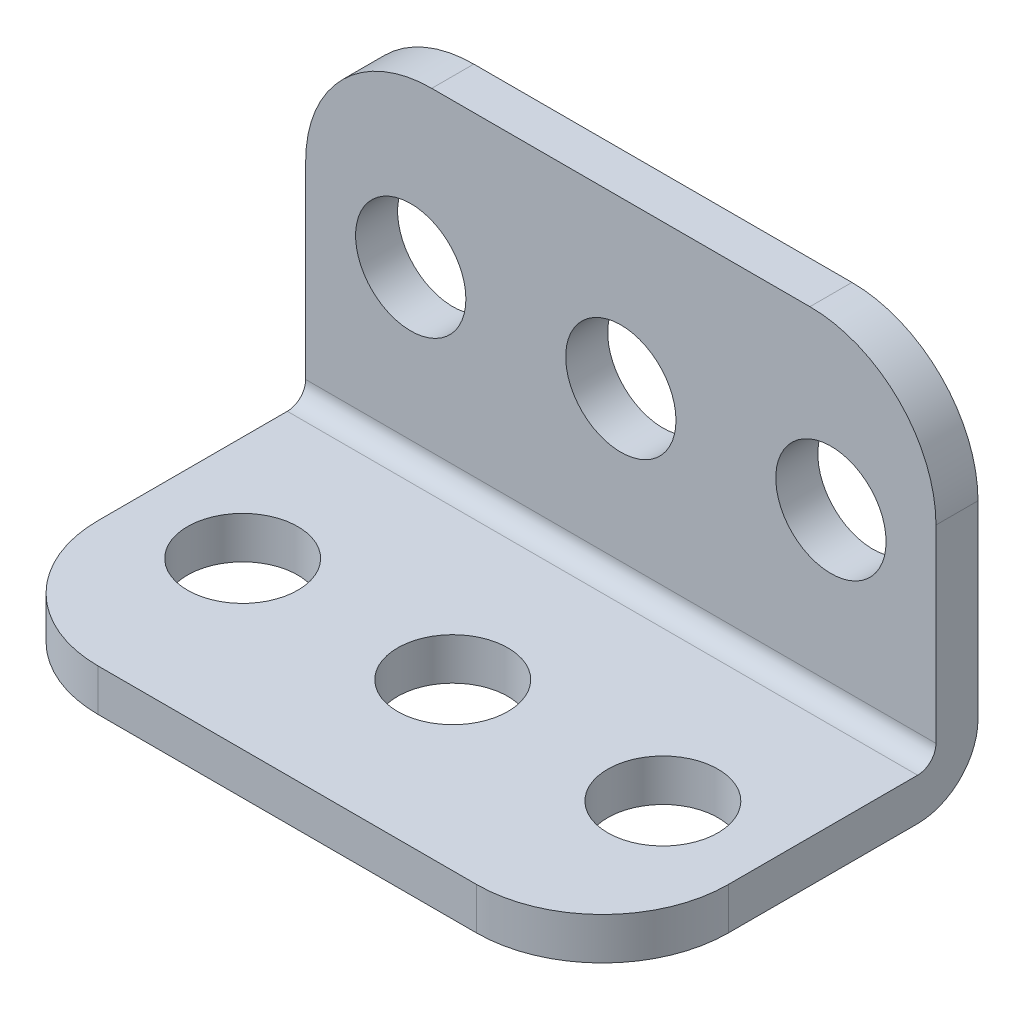
ISO-10303-21;
HEADER;
FILE_DESCRIPTION(('STEP AP214'),'2;1');
FILE_NAME('part.step','',(''),(''),'','','');
FILE_SCHEMA(('AUTOMOTIVE_DESIGN { 1 0 10303 214 1 1 1 1 }'));
ENDSEC;
DATA;
#1=APPLICATION_CONTEXT('core data for automotive mechanical design processes');
#2=APPLICATION_PROTOCOL_DEFINITION('international standard','automotive_design',2000,#1);
#3=PRODUCT_CONTEXT('',#1,'mechanical');
#4=PRODUCT('Part','Part','',(#3));
#5=PRODUCT_RELATED_PRODUCT_CATEGORY('part','',(#4));
#6=PRODUCT_DEFINITION_FORMATION('','',#4);
#7=PRODUCT_DEFINITION_CONTEXT('part definition',#1,'design');
#8=PRODUCT_DEFINITION('design','',#6,#7);
#9=PRODUCT_DEFINITION_SHAPE('','',#8);
#10=(LENGTH_UNIT() NAMED_UNIT(*) SI_UNIT(.MILLI.,.METRE.));
#11=(NAMED_UNIT(*) PLANE_ANGLE_UNIT() SI_UNIT($,.RADIAN.));
#12=(NAMED_UNIT(*) SI_UNIT($,.STERADIAN.) SOLID_ANGLE_UNIT());
#13=UNCERTAINTY_MEASURE_WITH_UNIT(LENGTH_MEASURE(1.E-05),#10,'distance_accuracy_value','');
#14=(GEOMETRIC_REPRESENTATION_CONTEXT(3) GLOBAL_UNCERTAINTY_ASSIGNED_CONTEXT((#13)) GLOBAL_UNIT_ASSIGNED_CONTEXT((#10,
#11,#12)) REPRESENTATION_CONTEXT('',''));
#15=CARTESIAN_POINT('',(0.,0.,0.));
#16=DIRECTION('',(0.,0.,1.));
#17=DIRECTION('',(1.,0.,0.));
#18=AXIS2_PLACEMENT_3D('',#15,#16,#17);
#19=CARTESIAN_POINT('',(19.2,7.9,-14.3));
#20=DIRECTION('',(0.,0.,1.));
#21=DIRECTION('',(0.,-1.,0.));
#22=AXIS2_PLACEMENT_3D('',#19,#20,#21);
#23=CYLINDRICAL_SURFACE('',#22,4.8);
#24=CARTESIAN_POINT('',(19.2,7.9,-14.3));
#25=DIRECTION('',(0.,0.,1.));
#26=DIRECTION('',(0.,-1.,0.));
#27=AXIS2_PLACEMENT_3D('',#24,#25,#26);
#28=CIRCLE('',#27,4.8);
#29=CARTESIAN_POINT('',(24.,7.9,-14.3));
#30=VERTEX_POINT('',#29);
#31=CARTESIAN_POINT('',(19.2,12.7,-14.3));
#32=VERTEX_POINT('',#31);
#33=EDGE_CURVE('E19',#30,#32,#28,.T.);
#34=ORIENTED_EDGE('',*,*,#33,.T.);
#35=DIRECTION('',(0.,0.,-1.));
#36=VECTOR('',#35,1.);
#37=CARTESIAN_POINT('',(19.2,12.7,-14.3));
#38=LINE('',#37,#36);
#39=CARTESIAN_POINT('',(19.2,12.7,-12.7));
#40=VERTEX_POINT('',#39);
#41=EDGE_CURVE('E109',#32,#40,#38,.F.);
#42=ORIENTED_EDGE('',*,*,#41,.T.);
#43=CARTESIAN_POINT('',(19.2,7.90000000000001,-12.7));
#44=DIRECTION('',(0.,0.,1.));
#45=DIRECTION('',(0.,-1.,0.));
#46=AXIS2_PLACEMENT_3D('',#43,#44,#45);
#47=CIRCLE('',#46,4.8);
#48=CARTESIAN_POINT('',(24.,7.90000000000001,-12.7));
#49=VERTEX_POINT('',#48);
#50=EDGE_CURVE('E105',#49,#40,#47,.T.);
#51=ORIENTED_EDGE('',*,*,#50,.F.);
#52=DIRECTION('',(0.,0.,1.));
#53=VECTOR('',#52,1.);
#54=CARTESIAN_POINT('',(24.,7.9,-14.3));
#55=LINE('',#54,#53);
#56=EDGE_CURVE('E102',#49,#30,#55,.F.);
#57=ORIENTED_EDGE('',*,*,#56,.T.);
#58=EDGE_LOOP('',(#34,#42,#51,#57));
#59=FACE_BOUND('',#58,.T.);
#60=ADVANCED_FACE('F16',(#59),#23,.T.);
#61=CARTESIAN_POINT('',(24.,12.7,-14.3));
#62=DIRECTION('',(0.,-1.,0.));
#63=DIRECTION('',(0.,0.,-1.));
#64=AXIS2_PLACEMENT_3D('',#61,#62,#63);
#65=PLANE('',#64);
#66=DIRECTION('',(1.,0.,0.));
#67=VECTOR('',#66,1.);
#68=CARTESIAN_POINT('',(0.,12.7,-12.7));
#69=LINE('',#68,#67);
#70=CARTESIAN_POINT('',(4.8,12.7,-12.7));
#71=VERTEX_POINT('',#70);
#72=EDGE_CURVE('E158',#40,#71,#69,.F.);
#73=ORIENTED_EDGE('',*,*,#72,.F.);
#74=ORIENTED_EDGE('',*,*,#41,.F.);
#75=DIRECTION('',(1.,0.,0.));
#76=VECTOR('',#75,1.);
#77=CARTESIAN_POINT('',(0.,12.7,-14.3));
#78=LINE('',#77,#76);
#79=CARTESIAN_POINT('',(4.8,12.7,-14.3));
#80=VERTEX_POINT('',#79);
#81=EDGE_CURVE('E118',#32,#80,#78,.F.);
#82=ORIENTED_EDGE('',*,*,#81,.T.);
#83=DIRECTION('',(0.,0.,1.));
#84=VECTOR('',#83,1.);
#85=CARTESIAN_POINT('',(4.8,12.7,-14.3));
#86=LINE('',#85,#84);
#87=EDGE_CURVE('E168',#71,#80,#86,.F.);
#88=ORIENTED_EDGE('',*,*,#87,.F.);
#89=EDGE_LOOP('',(#73,#74,#82,#88));
#90=FACE_BOUND('',#89,.T.);
#91=ADVANCED_FACE('F268',(#90),#65,.F.);
#92=CARTESIAN_POINT('',(4.8,7.9,-14.3));
#93=DIRECTION('',(0.,0.,1.));
#94=DIRECTION('',(0.,-1.,0.));
#95=AXIS2_PLACEMENT_3D('',#92,#93,#94);
#96=CYLINDRICAL_SURFACE('',#95,4.8);
#97=CARTESIAN_POINT('',(4.8,7.9,-14.3));
#98=DIRECTION('',(0.,0.,1.));
#99=DIRECTION('',(0.,-1.,0.));
#100=AXIS2_PLACEMENT_3D('',#97,#98,#99);
#101=CIRCLE('',#100,4.8);
#102=CARTESIAN_POINT('',(0.,7.9,-14.3));
#103=VERTEX_POINT('',#102);
#104=EDGE_CURVE('E162',#80,#103,#101,.T.);
#105=ORIENTED_EDGE('',*,*,#104,.T.);
#106=DIRECTION('',(0.,0.,1.));
#107=VECTOR('',#106,1.);
#108=CARTESIAN_POINT('',(0.,7.9,-14.3));
#109=LINE('',#108,#107);
#110=CARTESIAN_POINT('',(0.,7.90000000000001,-12.7));
#111=VERTEX_POINT('',#110);
#112=EDGE_CURVE('E164',#103,#111,#109,.T.);
#113=ORIENTED_EDGE('',*,*,#112,.T.);
#114=CARTESIAN_POINT('',(4.8,7.90000000000001,-12.7));
#115=DIRECTION('',(0.,0.,1.));
#116=DIRECTION('',(0.,-1.,0.));
#117=AXIS2_PLACEMENT_3D('',#114,#115,#116);
#118=CIRCLE('',#117,4.8);
#119=EDGE_CURVE('E160',#71,#111,#118,.T.);
#120=ORIENTED_EDGE('',*,*,#119,.F.);
#121=ORIENTED_EDGE('',*,*,#87,.T.);
#122=EDGE_LOOP('',(#105,#113,#120,#121));
#123=FACE_BOUND('',#122,.T.);
#124=ADVANCED_FACE('F222',(#123),#96,.T.);
#125=CARTESIAN_POINT('',(4.,6.4,-22.7));
#126=DIRECTION('',(0.,0.,1.));
#127=DIRECTION('',(1.,0.,0.));
#128=AXIS2_PLACEMENT_3D('',#125,#126,#127);
#129=CYLINDRICAL_SURFACE('',#128,2.1);
#130=CARTESIAN_POINT('',(4.,6.4,-14.3));
#131=DIRECTION('',(0.,0.,1.));
#132=DIRECTION('',(1.,0.,0.));
#133=AXIS2_PLACEMENT_3D('',#130,#131,#132);
#134=CIRCLE('',#133,2.1);
#135=CARTESIAN_POINT('',(6.1,6.4,-14.3));
#136=VERTEX_POINT('',#135);
#137=EDGE_CURVE('E217',#136,#136,#134,.F.);
#138=ORIENTED_EDGE('',*,*,#137,.T.);
#139=EDGE_LOOP('',(#138));
#140=FACE_BOUND('',#139,.T.);
#141=CARTESIAN_POINT('',(4.,6.4,-12.7));
#142=DIRECTION('',(0.,0.,1.));
#143=DIRECTION('',(1.,0.,0.));
#144=AXIS2_PLACEMENT_3D('',#141,#142,#143);
#145=CIRCLE('',#144,2.1);
#146=CARTESIAN_POINT('',(6.1,6.4,-12.7));
#147=VERTEX_POINT('',#146);
#148=EDGE_CURVE('E205',#147,#147,#145,.F.);
#149=ORIENTED_EDGE('',*,*,#148,.F.);
#150=EDGE_LOOP('',(#149));
#151=FACE_BOUND('',#150,.T.);
#152=ADVANCED_FACE('F275',(#140,#151),#129,.F.);
#153=CARTESIAN_POINT('',(12.,6.4,-22.7));
#154=DIRECTION('',(0.,0.,1.));
#155=DIRECTION('',(1.,0.,0.));
#156=AXIS2_PLACEMENT_3D('',#153,#154,#155);
#157=CYLINDRICAL_SURFACE('',#156,2.1);
#158=CARTESIAN_POINT('',(12.,6.4,-14.3));
#159=DIRECTION('',(0.,0.,1.));
#160=DIRECTION('',(1.,0.,0.));
#161=AXIS2_PLACEMENT_3D('',#158,#159,#160);
#162=CIRCLE('',#161,2.1);
#163=CARTESIAN_POINT('',(14.1,6.4,-14.3));
#164=VERTEX_POINT('',#163);
#165=EDGE_CURVE('E214',#164,#164,#162,.F.);
#166=ORIENTED_EDGE('',*,*,#165,.T.);
#167=EDGE_LOOP('',(#166));
#168=FACE_BOUND('',#167,.T.);
#169=CARTESIAN_POINT('',(12.,6.4,-12.7));
#170=DIRECTION('',(0.,0.,1.));
#171=DIRECTION('',(1.,0.,0.));
#172=AXIS2_PLACEMENT_3D('',#169,#170,#171);
#173=CIRCLE('',#172,2.1);
#174=CARTESIAN_POINT('',(14.1,6.4,-12.7));
#175=VERTEX_POINT('',#174);
#176=EDGE_CURVE('E202',#175,#175,#173,.F.);
#177=ORIENTED_EDGE('',*,*,#176,.F.);
#178=EDGE_LOOP('',(#177));
#179=FACE_BOUND('',#178,.T.);
#180=ADVANCED_FACE('F325',(#168,#179),#157,.F.);
#181=CARTESIAN_POINT('',(20.,6.4,-22.7));
#182=DIRECTION('',(0.,0.,1.));
#183=DIRECTION('',(1.,0.,0.));
#184=AXIS2_PLACEMENT_3D('',#181,#182,#183);
#185=CYLINDRICAL_SURFACE('',#184,2.1);
#186=CARTESIAN_POINT('',(20.,6.4,-14.3));
#187=DIRECTION('',(0.,0.,1.));
#188=DIRECTION('',(1.,0.,0.));
#189=AXIS2_PLACEMENT_3D('',#186,#187,#188);
#190=CIRCLE('',#189,2.1);
#191=CARTESIAN_POINT('',(22.1,6.4,-14.3));
#192=VERTEX_POINT('',#191);
#193=EDGE_CURVE('E211',#192,#192,#190,.F.);
#194=ORIENTED_EDGE('',*,*,#193,.T.);
#195=EDGE_LOOP('',(#194));
#196=FACE_BOUND('',#195,.T.);
#197=CARTESIAN_POINT('',(20.,6.4,-12.7));
#198=DIRECTION('',(0.,0.,1.));
#199=DIRECTION('',(1.,0.,0.));
#200=AXIS2_PLACEMENT_3D('',#197,#198,#199);
#201=CIRCLE('',#200,2.1);
#202=CARTESIAN_POINT('',(22.1,6.4,-12.7));
#203=VERTEX_POINT('',#202);
#204=EDGE_CURVE('E166',#203,#203,#201,.F.);
#205=ORIENTED_EDGE('',*,*,#204,.F.);
#206=EDGE_LOOP('',(#205));
#207=FACE_BOUND('',#206,.T.);
#208=ADVANCED_FACE('F322',(#196,#207),#185,.F.);
#209=CARTESIAN_POINT('',(0.,0.699999999999995,-12.));
#210=DIRECTION('',(-1.,0.,0.));
#211=DIRECTION('',(0.,-1.,0.));
#212=AXIS2_PLACEMENT_3D('',#209,#210,#211);
#213=CYLINDRICAL_SURFACE('',#212,2.3);
#214=DIRECTION('',(1.,0.,0.));
#215=VECTOR('',#214,1.);
#216=CARTESIAN_POINT('',(0.,-1.6,-12.));
#217=LINE('',#216,#215);
#218=CARTESIAN_POINT('',(0.,-1.6,-12.));
#219=VERTEX_POINT('',#218);
#220=CARTESIAN_POINT('',(24.,-1.6,-12.));
#221=VERTEX_POINT('',#220);
#222=EDGE_CURVE('E151',#219,#221,#217,.T.);
#223=ORIENTED_EDGE('',*,*,#222,.F.);
#224=CARTESIAN_POINT('',(0.,0.699999999999995,-12.));
#225=DIRECTION('',(-1.,0.,0.));
#226=DIRECTION('',(0.,-1.,0.));
#227=AXIS2_PLACEMENT_3D('',#224,#225,#226);
#228=CIRCLE('',#227,2.3);
#229=CARTESIAN_POINT('',(0.,0.699999999999998,-14.3));
#230=VERTEX_POINT('',#229);
#231=EDGE_CURVE('E144',#230,#219,#228,.T.);
#232=ORIENTED_EDGE('',*,*,#231,.F.);
#233=DIRECTION('',(1.,0.,0.));
#234=VECTOR('',#233,1.);
#235=CARTESIAN_POINT('',(0.,0.700000000000002,-14.3));
#236=LINE('',#235,#234);
#237=CARTESIAN_POINT('',(24.,0.699999999999997,-14.3));
#238=VERTEX_POINT('',#237);
#239=EDGE_CURVE('E119',#230,#238,#236,.T.);
#240=ORIENTED_EDGE('',*,*,#239,.T.);
#241=CARTESIAN_POINT('',(24.,0.699999999999993,-12.));
#242=DIRECTION('',(-1.,0.,0.));
#243=DIRECTION('',(0.,-1.,0.));
#244=AXIS2_PLACEMENT_3D('',#241,#242,#243);
#245=CIRCLE('',#244,2.3);
#246=EDGE_CURVE('E124',#221,#238,#245,.F.);
#247=ORIENTED_EDGE('',*,*,#246,.F.);
#248=EDGE_LOOP('',(#223,#232,#240,#247));
#249=FACE_BOUND('',#248,.T.);
#250=ADVANCED_FACE('F230',(#249),#213,.T.);
#251=CARTESIAN_POINT('',(0.,0.,-14.3));
#252=DIRECTION('',(0.,0.,1.));
#253=DIRECTION('',(0.,-1.,0.));
#254=AXIS2_PLACEMENT_3D('',#251,#252,#253);
#255=PLANE('',#254);
#256=ORIENTED_EDGE('',*,*,#193,.F.);
#257=EDGE_LOOP('',(#256));
#258=FACE_BOUND('',#257,.T.);
#259=ORIENTED_EDGE('',*,*,#165,.F.);
#260=EDGE_LOOP('',(#259));
#261=FACE_BOUND('',#260,.T.);
#262=ORIENTED_EDGE('',*,*,#137,.F.);
#263=EDGE_LOOP('',(#262));
#264=FACE_BOUND('',#263,.T.);
#265=ORIENTED_EDGE('',*,*,#81,.F.);
#266=ORIENTED_EDGE('',*,*,#33,.F.);
#267=DIRECTION('',(0.,1.,0.));
#268=VECTOR('',#267,1.);
#269=CARTESIAN_POINT('',(24.,-1.6,-14.3));
#270=LINE('',#269,#268);
#271=EDGE_CURVE('E115',#238,#30,#270,.T.);
#272=ORIENTED_EDGE('',*,*,#271,.F.);
#273=ORIENTED_EDGE('',*,*,#239,.F.);
#274=DIRECTION('',(0.,1.,0.));
#275=VECTOR('',#274,1.);
#276=CARTESIAN_POINT('',(0.,-1.6,-14.3));
#277=LINE('',#276,#275);
#278=EDGE_CURVE('E145',#103,#230,#277,.F.);
#279=ORIENTED_EDGE('',*,*,#278,.F.);
#280=ORIENTED_EDGE('',*,*,#104,.F.);
#281=EDGE_LOOP('',(#265,#266,#272,#273,#279,#280));
#282=FACE_BOUND('',#281,.T.);
#283=ADVANCED_FACE('F114',(#258,#261,#264,#282),#255,.F.);
#284=CARTESIAN_POINT('',(0.,0.,-12.7));
#285=DIRECTION('',(0.,0.,1.));
#286=DIRECTION('',(0.,-1.,0.));
#287=AXIS2_PLACEMENT_3D('',#284,#285,#286);
#288=PLANE('',#287);
#289=ORIENTED_EDGE('',*,*,#204,.T.);
#290=EDGE_LOOP('',(#289));
#291=FACE_BOUND('',#290,.T.);
#292=ORIENTED_EDGE('',*,*,#176,.T.);
#293=EDGE_LOOP('',(#292));
#294=FACE_BOUND('',#293,.T.);
#295=ORIENTED_EDGE('',*,*,#148,.T.);
#296=EDGE_LOOP('',(#295));
#297=FACE_BOUND('',#296,.T.);
#298=DIRECTION('',(0.,1.,0.));
#299=VECTOR('',#298,1.);
#300=CARTESIAN_POINT('',(0.,-1.6,-12.7));
#301=LINE('',#300,#299);
#302=CARTESIAN_POINT('',(0.,0.699999999999993,-12.7));
#303=VERTEX_POINT('',#302);
#304=EDGE_CURVE('E148',#303,#111,#301,.T.);
#305=ORIENTED_EDGE('',*,*,#304,.F.);
#306=DIRECTION('',(-1.,0.,0.));
#307=VECTOR('',#306,1.);
#308=CARTESIAN_POINT('',(0.,0.699999999999992,-12.7));
#309=LINE('',#308,#307);
#310=CARTESIAN_POINT('',(24.,0.699999999999992,-12.7));
#311=VERTEX_POINT('',#310);
#312=EDGE_CURVE('E135',#303,#311,#309,.F.);
#313=ORIENTED_EDGE('',*,*,#312,.T.);
#314=DIRECTION('',(0.,1.,0.));
#315=VECTOR('',#314,1.);
#316=CARTESIAN_POINT('',(24.,-1.6,-12.7));
#317=LINE('',#316,#315);
#318=EDGE_CURVE('E126',#49,#311,#317,.F.);
#319=ORIENTED_EDGE('',*,*,#318,.F.);
#320=ORIENTED_EDGE('',*,*,#50,.T.);
#321=ORIENTED_EDGE('',*,*,#72,.T.);
#322=ORIENTED_EDGE('',*,*,#119,.T.);
#323=EDGE_LOOP('',(#305,#313,#319,#320,#321,#322));
#324=FACE_BOUND('',#323,.T.);
#325=ADVANCED_FACE('F264',(#291,#294,#297,#324),#288,.T.);
#326=CARTESIAN_POINT('',(0.,-1.6,0.));
#327=DIRECTION('',(0.,-1.,0.));
#328=DIRECTION('',(0.,0.,-1.));
#329=AXIS2_PLACEMENT_3D('',#326,#327,#328);
#330=PLANE('',#329);
#331=CARTESIAN_POINT('',(20.,-1.6,-6.30000000000005));
#332=DIRECTION('',(0.,1.,0.));
#333=DIRECTION('',(0.,0.,1.));
#334=AXIS2_PLACEMENT_3D('',#331,#332,#333);
#335=CIRCLE('',#334,2.1);
#336=CARTESIAN_POINT('',(20.,-1.6,-4.20000000000005));
#337=VERTEX_POINT('',#336);
#338=EDGE_CURVE('E182',#337,#337,#335,.T.);
#339=ORIENTED_EDGE('',*,*,#338,.T.);
#340=EDGE_LOOP('',(#339));
#341=FACE_BOUND('',#340,.T.);
#342=CARTESIAN_POINT('',(12.,-1.6,-6.30000000000005));
#343=DIRECTION('',(0.,1.,0.));
#344=DIRECTION('',(0.,0.,1.));
#345=AXIS2_PLACEMENT_3D('',#342,#343,#344);
#346=CIRCLE('',#345,2.1);
#347=CARTESIAN_POINT('',(12.,-1.6,-4.20000000000005));
#348=VERTEX_POINT('',#347);
#349=EDGE_CURVE('E185',#348,#348,#346,.T.);
#350=ORIENTED_EDGE('',*,*,#349,.T.);
#351=EDGE_LOOP('',(#350));
#352=FACE_BOUND('',#351,.T.);
#353=CARTESIAN_POINT('',(4.,-1.6,-6.30000000000005));
#354=DIRECTION('',(0.,1.,0.));
#355=DIRECTION('',(0.,0.,1.));
#356=AXIS2_PLACEMENT_3D('',#353,#354,#355);
#357=CIRCLE('',#356,2.1);
#358=CARTESIAN_POINT('',(4.,-1.6,-4.20000000000005));
#359=VERTEX_POINT('',#358);
#360=EDGE_CURVE('E188',#359,#359,#357,.T.);
#361=ORIENTED_EDGE('',*,*,#360,.T.);
#362=EDGE_LOOP('',(#361));
#363=FACE_BOUND('',#362,.T.);
#364=DIRECTION('',(0.,0.,1.));
#365=VECTOR('',#364,1.);
#366=CARTESIAN_POINT('',(0.,-1.6,0.));
#367=LINE('',#366,#365);
#368=CARTESIAN_POINT('',(0.,-1.6,-4.8));
#369=VERTEX_POINT('',#368);
#370=EDGE_CURVE('E141',#219,#369,#367,.T.);
#371=ORIENTED_EDGE('',*,*,#370,.F.);
#372=ORIENTED_EDGE('',*,*,#222,.T.);
#373=DIRECTION('',(0.,0.,-1.));
#374=VECTOR('',#373,1.);
#375=CARTESIAN_POINT('',(24.,-1.6,0.));
#376=LINE('',#375,#374);
#377=CARTESIAN_POINT('',(24.,-1.6,-4.8));
#378=VERTEX_POINT('',#377);
#379=EDGE_CURVE('E130',#378,#221,#376,.T.);
#380=ORIENTED_EDGE('',*,*,#379,.F.);
#381=CARTESIAN_POINT('',(19.2,-1.6,-4.8));
#382=DIRECTION('',(0.,1.,0.));
#383=DIRECTION('',(0.,0.,1.));
#384=AXIS2_PLACEMENT_3D('',#381,#382,#383);
#385=CIRCLE('',#384,4.8);
#386=CARTESIAN_POINT('',(19.2,-1.6,0.));
#387=VERTEX_POINT('',#386);
#388=EDGE_CURVE('E194',#387,#378,#385,.T.);
#389=ORIENTED_EDGE('',*,*,#388,.F.);
#390=DIRECTION('',(1.,0.,0.));
#391=VECTOR('',#390,1.);
#392=CARTESIAN_POINT('',(0.,-1.6,0.));
#393=LINE('',#392,#391);
#394=CARTESIAN_POINT('',(4.8,-1.6,0.));
#395=VERTEX_POINT('',#394);
#396=EDGE_CURVE('E152',#395,#387,#393,.T.);
#397=ORIENTED_EDGE('',*,*,#396,.F.);
#398=CARTESIAN_POINT('',(4.8,-1.6,-4.8));
#399=DIRECTION('',(0.,1.,0.));
#400=DIRECTION('',(0.,0.,1.));
#401=AXIS2_PLACEMENT_3D('',#398,#399,#400);
#402=CIRCLE('',#401,4.8);
#403=EDGE_CURVE('E191',#369,#395,#402,.T.);
#404=ORIENTED_EDGE('',*,*,#403,.F.);
#405=EDGE_LOOP('',(#371,#372,#380,#389,#397,#404));
#406=FACE_BOUND('',#405,.T.);
#407=ADVANCED_FACE('F235',(#341,#352,#363,#406),#330,.T.);
#408=CARTESIAN_POINT('',(0.,-1.6,0.));
#409=DIRECTION('',(-1.,0.,0.));
#410=DIRECTION('',(0.,0.,1.));
#411=AXIS2_PLACEMENT_3D('',#408,#409,#410);
#412=PLANE('',#411);
#413=ORIENTED_EDGE('',*,*,#370,.T.);
#414=DIRECTION('',(0.,1.,0.));
#415=VECTOR('',#414,1.);
#416=CARTESIAN_POINT('',(0.,-1.6,-4.8));
#417=LINE('',#416,#415);
#418=CARTESIAN_POINT('',(0.,0.,-4.8));
#419=VERTEX_POINT('',#418);
#420=EDGE_CURVE('E193',#419,#369,#417,.F.);
#421=ORIENTED_EDGE('',*,*,#420,.F.);
#422=DIRECTION('',(0.,0.,-1.));
#423=VECTOR('',#422,1.);
#424=CARTESIAN_POINT('',(0.,0.,0.));
#425=LINE('',#424,#423);
#426=CARTESIAN_POINT('',(0.,0.,-12.));
#427=VERTEX_POINT('',#426);
#428=EDGE_CURVE('E140',#419,#427,#425,.T.);
#429=ORIENTED_EDGE('',*,*,#428,.T.);
#430=CARTESIAN_POINT('',(0.,0.699999999999995,-12.));
#431=DIRECTION('',(-1.,0.,0.));
#432=DIRECTION('',(0.,-1.,0.));
#433=AXIS2_PLACEMENT_3D('',#430,#431,#432);
#434=CIRCLE('',#433,0.700000000000001);
#435=EDGE_CURVE('E143',#427,#303,#434,.F.);
#436=ORIENTED_EDGE('',*,*,#435,.T.);
#437=ORIENTED_EDGE('',*,*,#304,.T.);
#438=ORIENTED_EDGE('',*,*,#112,.F.);
#439=ORIENTED_EDGE('',*,*,#278,.T.);
#440=ORIENTED_EDGE('',*,*,#231,.T.);
#441=EDGE_LOOP('',(#413,#421,#429,#436,#437,#438,#439,#440));
#442=FACE_BOUND('',#441,.T.);
#443=ADVANCED_FACE('F227',(#442),#412,.T.);
#444=CARTESIAN_POINT('',(0.,0.699999999999995,-12.));
#445=DIRECTION('',(-1.,0.,0.));
#446=DIRECTION('',(0.,-1.,0.));
#447=AXIS2_PLACEMENT_3D('',#444,#445,#446);
#448=CYLINDRICAL_SURFACE('',#447,0.700000000000001);
#449=ORIENTED_EDGE('',*,*,#312,.F.);
#450=ORIENTED_EDGE('',*,*,#435,.F.);
#451=DIRECTION('',(1.,0.,0.));
#452=VECTOR('',#451,1.);
#453=CARTESIAN_POINT('',(0.,0.,-12.));
#454=LINE('',#453,#452);
#455=CARTESIAN_POINT('',(24.,0.,-12.));
#456=VERTEX_POINT('',#455);
#457=EDGE_CURVE('E136',#427,#456,#454,.T.);
#458=ORIENTED_EDGE('',*,*,#457,.T.);
#459=CARTESIAN_POINT('',(24.,0.699999999999993,-12.));
#460=DIRECTION('',(-1.,0.,0.));
#461=DIRECTION('',(0.,-1.,0.));
#462=AXIS2_PLACEMENT_3D('',#459,#460,#461);
#463=CIRCLE('',#462,0.700000000000001);
#464=EDGE_CURVE('E128',#311,#456,#463,.T.);
#465=ORIENTED_EDGE('',*,*,#464,.F.);
#466=EDGE_LOOP('',(#449,#450,#458,#465));
#467=FACE_BOUND('',#466,.T.);
#468=ADVANCED_FACE('F262',(#467),#448,.F.);
#469=CARTESIAN_POINT('',(24.,-1.6,0.));
#470=DIRECTION('',(1.,0.,0.));
#471=DIRECTION('',(0.,0.,-1.));
#472=AXIS2_PLACEMENT_3D('',#469,#470,#471);
#473=PLANE('',#472);
#474=DIRECTION('',(0.,0.,-1.));
#475=VECTOR('',#474,1.);
#476=CARTESIAN_POINT('',(24.,0.,0.));
#477=LINE('',#476,#475);
#478=CARTESIAN_POINT('',(24.,0.,-4.8));
#479=VERTEX_POINT('',#478);
#480=EDGE_CURVE('E139',#456,#479,#477,.F.);
#481=ORIENTED_EDGE('',*,*,#480,.T.);
#482=DIRECTION('',(0.,1.,0.));
#483=VECTOR('',#482,1.);
#484=CARTESIAN_POINT('',(24.,-1.6,-4.8));
#485=LINE('',#484,#483);
#486=EDGE_CURVE('E155',#378,#479,#485,.T.);
#487=ORIENTED_EDGE('',*,*,#486,.F.);
#488=ORIENTED_EDGE('',*,*,#379,.T.);
#489=ORIENTED_EDGE('',*,*,#246,.T.);
#490=ORIENTED_EDGE('',*,*,#271,.T.);
#491=ORIENTED_EDGE('',*,*,#56,.F.);
#492=ORIENTED_EDGE('',*,*,#318,.T.);
#493=ORIENTED_EDGE('',*,*,#464,.T.);
#494=EDGE_LOOP('',(#481,#487,#488,#489,#490,#491,#492,#493));
#495=FACE_BOUND('',#494,.T.);
#496=ADVANCED_FACE('F121',(#495),#473,.T.);
#497=CARTESIAN_POINT('',(19.2,-1.6,-4.8));
#498=DIRECTION('',(0.,1.,0.));
#499=DIRECTION('',(0.,0.,1.));
#500=AXIS2_PLACEMENT_3D('',#497,#498,#499);
#501=CYLINDRICAL_SURFACE('',#500,4.8);
#502=ORIENTED_EDGE('',*,*,#388,.T.);
#503=ORIENTED_EDGE('',*,*,#486,.T.);
#504=CARTESIAN_POINT('',(19.2,0.,-4.8));
#505=DIRECTION('',(0.,1.,0.));
#506=DIRECTION('',(0.,0.,1.));
#507=AXIS2_PLACEMENT_3D('',#504,#505,#506);
#508=CIRCLE('',#507,4.8);
#509=CARTESIAN_POINT('',(19.2,0.,0.));
#510=VERTEX_POINT('',#509);
#511=EDGE_CURVE('E179',#479,#510,#508,.F.);
#512=ORIENTED_EDGE('',*,*,#511,.T.);
#513=DIRECTION('',(0.,1.,0.));
#514=VECTOR('',#513,1.);
#515=CARTESIAN_POINT('',(19.2,-1.6,0.));
#516=LINE('',#515,#514);
#517=EDGE_CURVE('E154',#387,#510,#516,.T.);
#518=ORIENTED_EDGE('',*,*,#517,.F.);
#519=EDGE_LOOP('',(#502,#503,#512,#518));
#520=FACE_BOUND('',#519,.T.);
#521=ADVANCED_FACE('F248',(#520),#501,.T.);
#522=CARTESIAN_POINT('',(0.,-1.6,0.));
#523=DIRECTION('',(0.,0.,1.));
#524=DIRECTION('',(1.,0.,0.));
#525=AXIS2_PLACEMENT_3D('',#522,#523,#524);
#526=PLANE('',#525);
#527=DIRECTION('',(1.,0.,0.));
#528=VECTOR('',#527,1.);
#529=CARTESIAN_POINT('',(0.,0.,0.));
#530=LINE('',#529,#528);
#531=CARTESIAN_POINT('',(4.8,0.,0.));
#532=VERTEX_POINT('',#531);
#533=EDGE_CURVE('E178',#510,#532,#530,.F.);
#534=ORIENTED_EDGE('',*,*,#533,.T.);
#535=DIRECTION('',(0.,1.,0.));
#536=VECTOR('',#535,1.);
#537=CARTESIAN_POINT('',(4.8,-1.6,0.));
#538=LINE('',#537,#536);
#539=EDGE_CURVE('E34',#395,#532,#538,.T.);
#540=ORIENTED_EDGE('',*,*,#539,.F.);
#541=ORIENTED_EDGE('',*,*,#396,.T.);
#542=ORIENTED_EDGE('',*,*,#517,.T.);
#543=EDGE_LOOP('',(#534,#540,#541,#542));
#544=FACE_BOUND('',#543,.T.);
#545=ADVANCED_FACE('F299',(#544),#526,.T.);
#546=CARTESIAN_POINT('',(4.8,-1.6,-4.8));
#547=DIRECTION('',(0.,1.,0.));
#548=DIRECTION('',(0.,0.,1.));
#549=AXIS2_PLACEMENT_3D('',#546,#547,#548);
#550=CYLINDRICAL_SURFACE('',#549,4.8);
#551=ORIENTED_EDGE('',*,*,#403,.T.);
#552=ORIENTED_EDGE('',*,*,#539,.T.);
#553=CARTESIAN_POINT('',(4.8,0.,-4.8));
#554=DIRECTION('',(0.,1.,0.));
#555=DIRECTION('',(0.,0.,1.));
#556=AXIS2_PLACEMENT_3D('',#553,#554,#555);
#557=CIRCLE('',#556,4.8);
#558=EDGE_CURVE('E176',#532,#419,#557,.F.);
#559=ORIENTED_EDGE('',*,*,#558,.T.);
#560=ORIENTED_EDGE('',*,*,#420,.T.);
#561=EDGE_LOOP('',(#551,#552,#559,#560));
#562=FACE_BOUND('',#561,.T.);
#563=ADVANCED_FACE('F240',(#562),#550,.T.);
#564=CARTESIAN_POINT('',(4.,-10.,-6.30000000000005));
#565=DIRECTION('',(0.,1.,0.));
#566=DIRECTION('',(0.,0.,1.));
#567=AXIS2_PLACEMENT_3D('',#564,#565,#566);
#568=CYLINDRICAL_SURFACE('',#567,2.1);
#569=ORIENTED_EDGE('',*,*,#360,.F.);
#570=EDGE_LOOP('',(#569));
#571=FACE_BOUND('',#570,.T.);
#572=CARTESIAN_POINT('',(4.,0.,-6.30000000000005));
#573=DIRECTION('',(0.,1.,0.));
#574=DIRECTION('',(0.,0.,1.));
#575=AXIS2_PLACEMENT_3D('',#572,#573,#574);
#576=CIRCLE('',#575,2.1);
#577=CARTESIAN_POINT('',(4.,0.,-4.20000000000005));
#578=VERTEX_POINT('',#577);
#579=EDGE_CURVE('E173',#578,#578,#576,.T.);
#580=ORIENTED_EDGE('',*,*,#579,.T.);
#581=EDGE_LOOP('',(#580));
#582=FACE_BOUND('',#581,.T.);
#583=ADVANCED_FACE('F292',(#571,#582),#568,.F.);
#584=CARTESIAN_POINT('',(12.,-10.,-6.30000000000005));
#585=DIRECTION('',(0.,1.,0.));
#586=DIRECTION('',(0.,0.,1.));
#587=AXIS2_PLACEMENT_3D('',#584,#585,#586);
#588=CYLINDRICAL_SURFACE('',#587,2.1);
#589=ORIENTED_EDGE('',*,*,#349,.F.);
#590=EDGE_LOOP('',(#589));
#591=FACE_BOUND('',#590,.T.);
#592=CARTESIAN_POINT('',(12.,0.,-6.30000000000005));
#593=DIRECTION('',(0.,1.,0.));
#594=DIRECTION('',(0.,0.,1.));
#595=AXIS2_PLACEMENT_3D('',#592,#593,#594);
#596=CIRCLE('',#595,2.1);
#597=CARTESIAN_POINT('',(12.,0.,-4.20000000000005));
#598=VERTEX_POINT('',#597);
#599=EDGE_CURVE('E25',#598,#598,#596,.T.);
#600=ORIENTED_EDGE('',*,*,#599,.T.);
#601=EDGE_LOOP('',(#600));
#602=FACE_BOUND('',#601,.T.);
#603=ADVANCED_FACE('F284',(#591,#602),#588,.F.);
#604=CARTESIAN_POINT('',(20.,-10.,-6.30000000000005));
#605=DIRECTION('',(0.,1.,0.));
#606=DIRECTION('',(0.,0.,1.));
#607=AXIS2_PLACEMENT_3D('',#604,#605,#606);
#608=CYLINDRICAL_SURFACE('',#607,2.1);
#609=ORIENTED_EDGE('',*,*,#338,.F.);
#610=EDGE_LOOP('',(#609));
#611=FACE_BOUND('',#610,.T.);
#612=CARTESIAN_POINT('',(20.,0.,-6.30000000000005));
#613=DIRECTION('',(0.,1.,0.));
#614=DIRECTION('',(0.,0.,1.));
#615=AXIS2_PLACEMENT_3D('',#612,#613,#614);
#616=CIRCLE('',#615,2.1);
#617=CARTESIAN_POINT('',(20.,0.,-4.20000000000005));
#618=VERTEX_POINT('',#617);
#619=EDGE_CURVE('E11',#618,#618,#616,.T.);
#620=ORIENTED_EDGE('',*,*,#619,.T.);
#621=EDGE_LOOP('',(#620));
#622=FACE_BOUND('',#621,.T.);
#623=ADVANCED_FACE('F278',(#611,#622),#608,.F.);
#624=CARTESIAN_POINT('',(0.,0.,0.));
#625=DIRECTION('',(0.,-1.,0.));
#626=DIRECTION('',(0.,0.,-1.));
#627=AXIS2_PLACEMENT_3D('',#624,#625,#626);
#628=PLANE('',#627);
#629=ORIENTED_EDGE('',*,*,#619,.F.);
#630=EDGE_LOOP('',(#629));
#631=FACE_BOUND('',#630,.T.);
#632=ORIENTED_EDGE('',*,*,#599,.F.);
#633=EDGE_LOOP('',(#632));
#634=FACE_BOUND('',#633,.T.);
#635=ORIENTED_EDGE('',*,*,#579,.F.);
#636=EDGE_LOOP('',(#635));
#637=FACE_BOUND('',#636,.T.);
#638=ORIENTED_EDGE('',*,*,#533,.F.);
#639=ORIENTED_EDGE('',*,*,#511,.F.);
#640=ORIENTED_EDGE('',*,*,#480,.F.);
#641=ORIENTED_EDGE('',*,*,#457,.F.);
#642=ORIENTED_EDGE('',*,*,#428,.F.);
#643=ORIENTED_EDGE('',*,*,#558,.F.);
#644=EDGE_LOOP('',(#638,#639,#640,#641,#642,#643));
#645=FACE_BOUND('',#644,.T.);
#646=ADVANCED_FACE('F254',(#631,#634,#637,#645),#628,.F.);
#647=CLOSED_SHELL('',(#60,#91,#124,#152,#180,#208,#250,#283,#325,#407,#443,#468,#496,#521,#545,
#563,#583,#603,#623,#646));
#648=MANIFOLD_SOLID_BREP('B1',#647);
#649=ADVANCED_BREP_SHAPE_REPRESENTATION('',(#18,#648),#14);
#650=SHAPE_DEFINITION_REPRESENTATION(#9,#649);
ENDSEC;
END-ISO-10303-21;
